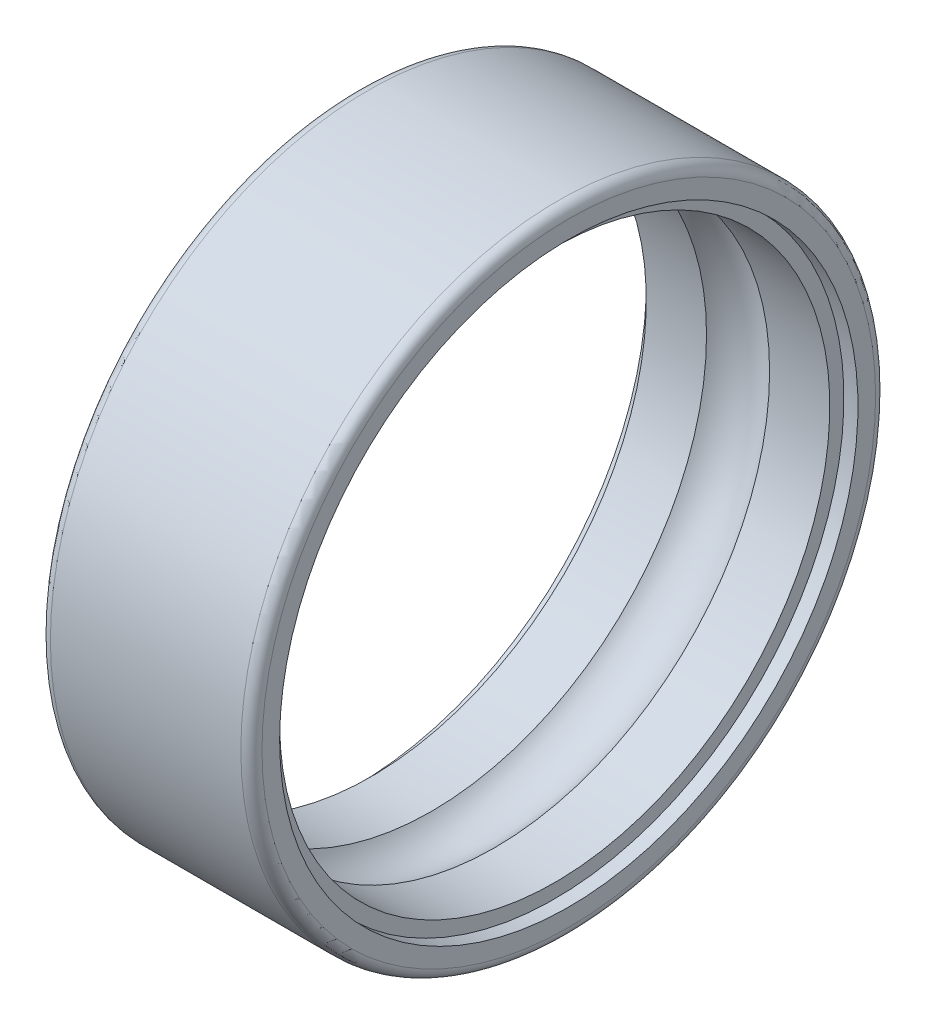
ISO-10303-21;
HEADER;
FILE_DESCRIPTION(('STEP AP214'),'2;1');
FILE_NAME('part.step','',(''),(''),'','','');
FILE_SCHEMA(('AUTOMOTIVE_DESIGN { 1 0 10303 214 1 1 1 1 }'));
ENDSEC;
DATA;
#1=APPLICATION_CONTEXT('core data for automotive mechanical design processes');
#2=APPLICATION_PROTOCOL_DEFINITION('international standard','automotive_design',2000,#1);
#3=PRODUCT_CONTEXT('',#1,'mechanical');
#4=PRODUCT('Part','Part','',(#3));
#5=PRODUCT_RELATED_PRODUCT_CATEGORY('part','',(#4));
#6=PRODUCT_DEFINITION_FORMATION('','',#4);
#7=PRODUCT_DEFINITION_CONTEXT('part definition',#1,'design');
#8=PRODUCT_DEFINITION('design','',#6,#7);
#9=PRODUCT_DEFINITION_SHAPE('','',#8);
#10=(LENGTH_UNIT() NAMED_UNIT(*) SI_UNIT(.MILLI.,.METRE.));
#11=(NAMED_UNIT(*) PLANE_ANGLE_UNIT() SI_UNIT($,.RADIAN.));
#12=(NAMED_UNIT(*) SI_UNIT($,.STERADIAN.) SOLID_ANGLE_UNIT());
#13=UNCERTAINTY_MEASURE_WITH_UNIT(LENGTH_MEASURE(1.E-05),#10,'distance_accuracy_value','');
#14=(GEOMETRIC_REPRESENTATION_CONTEXT(3) GLOBAL_UNCERTAINTY_ASSIGNED_CONTEXT((#13)) GLOBAL_UNIT_ASSIGNED_CONTEXT((#10,
#11,#12)) REPRESENTATION_CONTEXT('',''));
#15=CARTESIAN_POINT('',(0.,0.,0.));
#16=DIRECTION('',(0.,0.,1.));
#17=DIRECTION('',(1.,0.,0.));
#18=AXIS2_PLACEMENT_3D('',#15,#16,#17);
#19=CARTESIAN_POINT('',(2.8008,-4.101,4.101));
#20=DIRECTION('',(1.,0.,0.));
#21=DIRECTION('',(0.,0.,-1.));
#22=AXIS2_PLACEMENT_3D('',#19,#20,#21);
#23=PLANE('',#22);
#24=CARTESIAN_POINT('',(2.8008,0.,0.));
#25=DIRECTION('',(-1.,0.,0.));
#26=DIRECTION('',(0.,0.,1.));
#27=AXIS2_PLACEMENT_3D('',#24,#25,#26);
#28=CIRCLE('',#27,3.9);
#29=CARTESIAN_POINT('',(2.8008,0.,3.9));
#30=VERTEX_POINT('',#29);
#31=EDGE_CURVE('E48',#30,#30,#28,.F.);
#32=ORIENTED_EDGE('',*,*,#31,.F.);
#33=EDGE_LOOP('',(#32));
#34=FACE_BOUND('',#33,.T.);
#35=CARTESIAN_POINT('',(2.8008,0.,0.));
#36=DIRECTION('',(-1.,0.,0.));
#37=DIRECTION('',(0.,0.,1.));
#38=AXIS2_PLACEMENT_3D('',#35,#36,#37);
#39=CIRCLE('',#38,4.1);
#40=CARTESIAN_POINT('',(2.8008,0.,4.1));
#41=VERTEX_POINT('',#40);
#42=EDGE_CURVE('E19',#41,#41,#39,.T.);
#43=ORIENTED_EDGE('',*,*,#42,.F.);
#44=EDGE_LOOP('',(#43));
#45=FACE_BOUND('',#44,.T.);
#46=ADVANCED_FACE('F15',(#34,#45),#23,.T.);
#47=CARTESIAN_POINT('',(3.,0.,0.));
#48=DIRECTION('',(-1.,0.,0.));
#49=DIRECTION('',(0.,0.,1.));
#50=AXIS2_PLACEMENT_3D('',#47,#48,#49);
#51=CYLINDRICAL_SURFACE('',#50,4.1);
#52=ORIENTED_EDGE('',*,*,#42,.T.);
#53=EDGE_LOOP('',(#52));
#54=FACE_BOUND('',#53,.T.);
#55=CARTESIAN_POINT('',(3.,0.,0.));
#56=DIRECTION('',(-1.,0.,0.));
#57=DIRECTION('',(0.,0.,1.));
#58=AXIS2_PLACEMENT_3D('',#55,#56,#57);
#59=CIRCLE('',#58,4.1);
#60=CARTESIAN_POINT('',(3.,0.,4.1));
#61=VERTEX_POINT('',#60);
#62=EDGE_CURVE('E46',#61,#61,#59,.T.);
#63=ORIENTED_EDGE('',*,*,#62,.F.);
#64=EDGE_LOOP('',(#63));
#65=FACE_BOUND('',#64,.T.);
#66=ADVANCED_FACE('F55',(#54,#65),#51,.F.);
#67=CARTESIAN_POINT('',(2.8008,0.,0.));
#68=DIRECTION('',(-1.,0.,0.));
#69=DIRECTION('',(0.,0.,1.));
#70=AXIS2_PLACEMENT_3D('',#67,#68,#69);
#71=CYLINDRICAL_SURFACE('',#70,3.9);
#72=CARTESIAN_POINT('',(1.94721359549996,0.,0.));
#73=DIRECTION('',(1.,0.,0.));
#74=DIRECTION('',(0.,0.,-1.));
#75=AXIS2_PLACEMENT_3D('',#72,#73,#74);
#76=CIRCLE('',#75,3.9);
#77=CARTESIAN_POINT('',(1.94721359549996,0.,-3.9));
#78=VERTEX_POINT('',#77);
#79=EDGE_CURVE('E45',#78,#78,#76,.T.);
#80=ORIENTED_EDGE('',*,*,#79,.F.);
#81=EDGE_LOOP('',(#80));
#82=FACE_BOUND('',#81,.T.);
#83=ORIENTED_EDGE('',*,*,#31,.T.);
#84=EDGE_LOOP('',(#83));
#85=FACE_BOUND('',#84,.T.);
#86=ADVANCED_FACE('F65',(#82,#85),#71,.F.);
#87=CARTESIAN_POINT('',(3.,-4.351,4.351));
#88=DIRECTION('',(1.,0.,0.));
#89=DIRECTION('',(0.,0.,-1.));
#90=AXIS2_PLACEMENT_3D('',#87,#88,#89);
#91=PLANE('',#90);
#92=ORIENTED_EDGE('',*,*,#62,.T.);
#93=EDGE_LOOP('',(#92));
#94=FACE_BOUND('',#93,.T.);
#95=CARTESIAN_POINT('',(3.,0.,0.));
#96=DIRECTION('',(1.,0.,0.));
#97=DIRECTION('',(0.,0.,-1.));
#98=AXIS2_PLACEMENT_3D('',#95,#96,#97);
#99=CIRCLE('',#98,4.35000000000193);
#100=CARTESIAN_POINT('',(3.,0.,-4.35000000000193));
#101=VERTEX_POINT('',#100);
#102=EDGE_CURVE('E41',#101,#101,#99,.F.);
#103=ORIENTED_EDGE('',*,*,#102,.F.);
#104=EDGE_LOOP('',(#103));
#105=FACE_BOUND('',#104,.T.);
#106=ADVANCED_FACE('F102',(#94,#105),#91,.T.);
#107=CARTESIAN_POINT('',(1.5,0.,0.));
#108=DIRECTION('',(1.,0.,0.));
#109=DIRECTION('',(0.,0.,-1.));
#110=AXIS2_PLACEMENT_3D('',#107,#108,#109);
#111=TOROIDAL_SURFACE('',#110,3.50000000000001,0.599999999999996);
#112=ORIENTED_EDGE('',*,*,#79,.T.);
#113=EDGE_LOOP('',(#112));
#114=FACE_BOUND('',#113,.T.);
#115=CARTESIAN_POINT('',(1.05278640450004,0.,0.));
#116=DIRECTION('',(1.,0.,0.));
#117=DIRECTION('',(0.,0.,-1.));
#118=AXIS2_PLACEMENT_3D('',#115,#116,#117);
#119=CIRCLE('',#118,3.9);
#120=CARTESIAN_POINT('',(1.05278640450004,0.,-3.9));
#121=VERTEX_POINT('',#120);
#122=EDGE_CURVE('E44',#121,#121,#119,.T.);
#123=ORIENTED_EDGE('',*,*,#122,.F.);
#124=EDGE_LOOP('',(#123));
#125=FACE_BOUND('',#124,.T.);
#126=ADVANCED_FACE('F98',(#114,#125),#111,.F.);
#127=CARTESIAN_POINT('',(2.85,0.,0.));
#128=DIRECTION('',(1.,0.,0.));
#129=DIRECTION('',(0.,0.,-1.));
#130=AXIS2_PLACEMENT_3D('',#127,#128,#129);
#131=TOROIDAL_SURFACE('',#130,4.35,0.15);
#132=CARTESIAN_POINT('',(2.85,0.,0.));
#133=DIRECTION('',(-1.,0.,0.));
#134=DIRECTION('',(0.,0.,1.));
#135=AXIS2_PLACEMENT_3D('',#132,#133,#134);
#136=CIRCLE('',#135,4.5);
#137=CARTESIAN_POINT('',(2.85,0.,4.5));
#138=VERTEX_POINT('',#137);
#139=EDGE_CURVE('E40',#138,#138,#136,.T.);
#140=ORIENTED_EDGE('',*,*,#139,.F.);
#141=EDGE_LOOP('',(#140));
#142=FACE_BOUND('',#141,.T.);
#143=ORIENTED_EDGE('',*,*,#102,.T.);
#144=EDGE_LOOP('',(#143));
#145=FACE_BOUND('',#144,.T.);
#146=ADVANCED_FACE('F112',(#142,#145),#131,.T.);
#147=CARTESIAN_POINT('',(1.05278640450004,0.,0.));
#148=DIRECTION('',(-1.,0.,0.));
#149=DIRECTION('',(0.,0.,1.));
#150=AXIS2_PLACEMENT_3D('',#147,#148,#149);
#151=CYLINDRICAL_SURFACE('',#150,3.9);
#152=CARTESIAN_POINT('',(0.1992,0.,0.));
#153=DIRECTION('',(-1.,0.,0.));
#154=DIRECTION('',(0.,0.,1.));
#155=AXIS2_PLACEMENT_3D('',#152,#153,#154);
#156=CIRCLE('',#155,3.9);
#157=CARTESIAN_POINT('',(0.1992,0.,3.9));
#158=VERTEX_POINT('',#157);
#159=EDGE_CURVE('E37',#158,#158,#156,.F.);
#160=ORIENTED_EDGE('',*,*,#159,.F.);
#161=EDGE_LOOP('',(#160));
#162=FACE_BOUND('',#161,.T.);
#163=ORIENTED_EDGE('',*,*,#122,.T.);
#164=EDGE_LOOP('',(#163));
#165=FACE_BOUND('',#164,.T.);
#166=ADVANCED_FACE('F115',(#162,#165),#151,.F.);
#167=CARTESIAN_POINT('',(0.15,0.,0.));
#168=DIRECTION('',(1.,0.,0.));
#169=DIRECTION('',(0.,0.,-1.));
#170=AXIS2_PLACEMENT_3D('',#167,#168,#169);
#171=CYLINDRICAL_SURFACE('',#170,4.5);
#172=ORIENTED_EDGE('',*,*,#139,.T.);
#173=EDGE_LOOP('',(#172));
#174=FACE_BOUND('',#173,.T.);
#175=CARTESIAN_POINT('',(0.15,0.,0.));
#176=DIRECTION('',(-1.,0.,0.));
#177=DIRECTION('',(0.,0.,1.));
#178=AXIS2_PLACEMENT_3D('',#175,#176,#177);
#179=CIRCLE('',#178,4.5);
#180=CARTESIAN_POINT('',(0.15,0.,4.5));
#181=VERTEX_POINT('',#180);
#182=EDGE_CURVE('E36',#181,#181,#179,.T.);
#183=ORIENTED_EDGE('',*,*,#182,.F.);
#184=EDGE_LOOP('',(#183));
#185=FACE_BOUND('',#184,.T.);
#186=ADVANCED_FACE('F119',(#174,#185),#171,.T.);
#187=CARTESIAN_POINT('',(0.1992,-4.101,-4.101));
#188=DIRECTION('',(-1.,0.,0.));
#189=DIRECTION('',(0.,0.,1.));
#190=AXIS2_PLACEMENT_3D('',#187,#188,#189);
#191=PLANE('',#190);
#192=ORIENTED_EDGE('',*,*,#159,.T.);
#193=EDGE_LOOP('',(#192));
#194=FACE_BOUND('',#193,.T.);
#195=CARTESIAN_POINT('',(0.1992,0.,0.));
#196=DIRECTION('',(-1.,0.,0.));
#197=DIRECTION('',(0.,0.,1.));
#198=AXIS2_PLACEMENT_3D('',#195,#196,#197);
#199=CIRCLE('',#198,4.1);
#200=CARTESIAN_POINT('',(0.1992,0.,4.1));
#201=VERTEX_POINT('',#200);
#202=EDGE_CURVE('E28',#201,#201,#199,.F.);
#203=ORIENTED_EDGE('',*,*,#202,.F.);
#204=EDGE_LOOP('',(#203));
#205=FACE_BOUND('',#204,.T.);
#206=ADVANCED_FACE('F79',(#194,#205),#191,.T.);
#207=CARTESIAN_POINT('',(0.15,0.,0.));
#208=DIRECTION('',(1.,0.,0.));
#209=DIRECTION('',(0.,0.,-1.));
#210=AXIS2_PLACEMENT_3D('',#207,#208,#209);
#211=TOROIDAL_SURFACE('',#210,4.35,0.150000000000001);
#212=CARTESIAN_POINT('',(0.,0.,0.));
#213=DIRECTION('',(1.,0.,0.));
#214=DIRECTION('',(0.,0.,-1.));
#215=AXIS2_PLACEMENT_3D('',#212,#213,#214);
#216=CIRCLE('',#215,4.35);
#217=CARTESIAN_POINT('',(0.,0.,-4.35));
#218=VERTEX_POINT('',#217);
#219=EDGE_CURVE('E23',#218,#218,#216,.F.);
#220=ORIENTED_EDGE('',*,*,#219,.F.);
#221=EDGE_LOOP('',(#220));
#222=FACE_BOUND('',#221,.T.);
#223=ORIENTED_EDGE('',*,*,#182,.T.);
#224=EDGE_LOOP('',(#223));
#225=FACE_BOUND('',#224,.T.);
#226=ADVANCED_FACE('F72',(#222,#225),#211,.T.);
#227=CARTESIAN_POINT('',(0.1992,0.,0.));
#228=DIRECTION('',(-1.,0.,0.));
#229=DIRECTION('',(0.,0.,1.));
#230=AXIS2_PLACEMENT_3D('',#227,#228,#229);
#231=CYLINDRICAL_SURFACE('',#230,4.1);
#232=CARTESIAN_POINT('',(0.,0.,0.));
#233=DIRECTION('',(-1.,0.,0.));
#234=DIRECTION('',(0.,0.,1.));
#235=AXIS2_PLACEMENT_3D('',#232,#233,#234);
#236=CIRCLE('',#235,4.1);
#237=CARTESIAN_POINT('',(0.,0.,4.1));
#238=VERTEX_POINT('',#237);
#239=EDGE_CURVE('E10',#238,#238,#236,.F.);
#240=ORIENTED_EDGE('',*,*,#239,.F.);
#241=EDGE_LOOP('',(#240));
#242=FACE_BOUND('',#241,.T.);
#243=ORIENTED_EDGE('',*,*,#202,.T.);
#244=EDGE_LOOP('',(#243));
#245=FACE_BOUND('',#244,.T.);
#246=ADVANCED_FACE('F68',(#242,#245),#231,.F.);
#247=CARTESIAN_POINT('',(0.,-4.351,-4.351));
#248=DIRECTION('',(-1.,0.,0.));
#249=DIRECTION('',(0.,0.,1.));
#250=AXIS2_PLACEMENT_3D('',#247,#248,#249);
#251=PLANE('',#250);
#252=ORIENTED_EDGE('',*,*,#239,.T.);
#253=EDGE_LOOP('',(#252));
#254=FACE_BOUND('',#253,.T.);
#255=ORIENTED_EDGE('',*,*,#219,.T.);
#256=EDGE_LOOP('',(#255));
#257=FACE_BOUND('',#256,.T.);
#258=ADVANCED_FACE('F17',(#254,#257),#251,.T.);
#259=CLOSED_SHELL('',(#46,#66,#86,#106,#126,#146,#166,#186,#206,#226,#246,#258));
#260=MANIFOLD_SOLID_BREP('B1',#259);
#261=ADVANCED_BREP_SHAPE_REPRESENTATION('',(#18,#260),#14);
#262=SHAPE_DEFINITION_REPRESENTATION(#9,#261);
ENDSEC;
END-ISO-10303-21;
